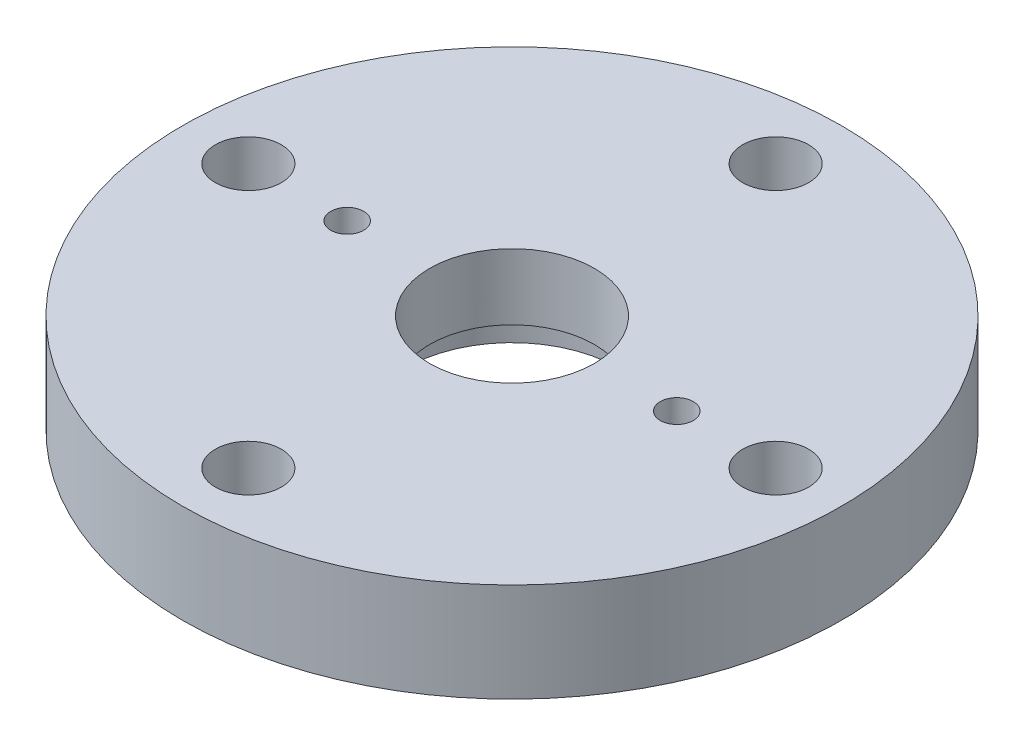
ISO-10303-21;
HEADER;
FILE_DESCRIPTION(('STEP AP214'),'2;1');
FILE_NAME('part.step','',(''),(''),'','','');
FILE_SCHEMA(('AUTOMOTIVE_DESIGN { 1 0 10303 214 1 1 1 1 }'));
ENDSEC;
DATA;
#1=APPLICATION_CONTEXT('core data for automotive mechanical design processes');
#2=APPLICATION_PROTOCOL_DEFINITION('international standard','automotive_design',2000,#1);
#3=PRODUCT_CONTEXT('',#1,'mechanical');
#4=PRODUCT('Part','Part','',(#3));
#5=PRODUCT_RELATED_PRODUCT_CATEGORY('part','',(#4));
#6=PRODUCT_DEFINITION_FORMATION('','',#4);
#7=PRODUCT_DEFINITION_CONTEXT('part definition',#1,'design');
#8=PRODUCT_DEFINITION('design','',#6,#7);
#9=PRODUCT_DEFINITION_SHAPE('','',#8);
#10=(LENGTH_UNIT() NAMED_UNIT(*) SI_UNIT(.MILLI.,.METRE.));
#11=(NAMED_UNIT(*) PLANE_ANGLE_UNIT() SI_UNIT($,.RADIAN.));
#12=(NAMED_UNIT(*) SI_UNIT($,.STERADIAN.) SOLID_ANGLE_UNIT());
#13=UNCERTAINTY_MEASURE_WITH_UNIT(LENGTH_MEASURE(1.E-05),#10,'distance_accuracy_value','');
#14=(GEOMETRIC_REPRESENTATION_CONTEXT(3) GLOBAL_UNCERTAINTY_ASSIGNED_CONTEXT((#13)) GLOBAL_UNIT_ASSIGNED_CONTEXT((#10,
#11,#12)) REPRESENTATION_CONTEXT('',''));
#15=CARTESIAN_POINT('',(0.,0.,0.));
#16=DIRECTION('',(0.,0.,1.));
#17=DIRECTION('',(1.,0.,0.));
#18=AXIS2_PLACEMENT_3D('',#15,#16,#17);
#19=CARTESIAN_POINT('',(0.,0.,0.));
#20=DIRECTION('',(0.,1.,0.));
#21=DIRECTION('',(0.,0.,1.));
#22=AXIS2_PLACEMENT_3D('',#19,#20,#21);
#23=PLANE('',#22);
#24=CARTESIAN_POINT('',(0.,0.,8.));
#25=DIRECTION('',(0.,1.,0.));
#26=DIRECTION('',(0.,0.,1.));
#27=AXIS2_PLACEMENT_3D('',#24,#25,#26);
#28=CIRCLE('',#27,1.);
#29=CARTESIAN_POINT('',(0.,0.,9.));
#30=VERTEX_POINT('',#29);
#31=EDGE_CURVE('E78',#30,#30,#28,.T.);
#32=ORIENTED_EDGE('',*,*,#31,.T.);
#33=EDGE_LOOP('',(#32));
#34=FACE_BOUND('',#33,.T.);
#35=CARTESIAN_POINT('',(-8.,0.,0.));
#36=DIRECTION('',(0.,1.,0.));
#37=DIRECTION('',(0.,0.,-1.));
#38=AXIS2_PLACEMENT_3D('',#35,#36,#37);
#39=CIRCLE('',#38,1.);
#40=CARTESIAN_POINT('',(-8.,0.,-1.));
#41=VERTEX_POINT('',#40);
#42=EDGE_CURVE('E66',#41,#41,#39,.T.);
#43=ORIENTED_EDGE('',*,*,#42,.T.);
#44=EDGE_LOOP('',(#43));
#45=FACE_BOUND('',#44,.T.);
#46=CARTESIAN_POINT('',(5.,0.,0.));
#47=DIRECTION('',(0.,1.,0.));
#48=DIRECTION('',(0.,0.,1.));
#49=AXIS2_PLACEMENT_3D('',#46,#47,#48);
#50=CIRCLE('',#49,0.5);
#51=CARTESIAN_POINT('',(5.,0.,0.5));
#52=VERTEX_POINT('',#51);
#53=EDGE_CURVE('E54',#52,#52,#50,.T.);
#54=ORIENTED_EDGE('',*,*,#53,.T.);
#55=EDGE_LOOP('',(#54));
#56=FACE_BOUND('',#55,.T.);
#57=CARTESIAN_POINT('',(0.,0.,0.));
#58=DIRECTION('',(0.,1.,0.));
#59=DIRECTION('',(0.,0.,1.));
#60=AXIS2_PLACEMENT_3D('',#57,#58,#59);
#61=CIRCLE('',#60,10.);
#62=CARTESIAN_POINT('',(0.,0.,10.));
#63=VERTEX_POINT('',#62);
#64=EDGE_CURVE('E39',#63,#63,#61,.T.);
#65=ORIENTED_EDGE('',*,*,#64,.F.);
#66=EDGE_LOOP('',(#65));
#67=FACE_BOUND('',#66,.T.);
#68=CARTESIAN_POINT('',(8.,0.,0.));
#69=DIRECTION('',(0.,1.,0.));
#70=DIRECTION('',(0.,0.,1.));
#71=AXIS2_PLACEMENT_3D('',#68,#69,#70);
#72=CIRCLE('',#71,1.);
#73=CARTESIAN_POINT('',(8.,0.,1.));
#74=VERTEX_POINT('',#73);
#75=EDGE_CURVE('E48',#74,#74,#72,.T.);
#76=ORIENTED_EDGE('',*,*,#75,.T.);
#77=EDGE_LOOP('',(#76));
#78=FACE_BOUND('',#77,.T.);
#79=CARTESIAN_POINT('',(-5.,0.,0.));
#80=DIRECTION('',(0.,1.,0.));
#81=DIRECTION('',(0.,0.,-1.));
#82=AXIS2_PLACEMENT_3D('',#79,#80,#81);
#83=CIRCLE('',#82,0.5);
#84=CARTESIAN_POINT('',(-5.,0.,-0.5));
#85=VERTEX_POINT('',#84);
#86=EDGE_CURVE('E60',#85,#85,#83,.T.);
#87=ORIENTED_EDGE('',*,*,#86,.T.);
#88=EDGE_LOOP('',(#87));
#89=FACE_BOUND('',#88,.T.);
#90=CARTESIAN_POINT('',(0.,0.,-8.));
#91=DIRECTION('',(0.,1.,0.));
#92=DIRECTION('',(0.,0.,-1.));
#93=AXIS2_PLACEMENT_3D('',#90,#91,#92);
#94=CIRCLE('',#93,1.);
#95=CARTESIAN_POINT('',(0.,0.,-9.));
#96=VERTEX_POINT('',#95);
#97=EDGE_CURVE('E72',#96,#96,#94,.T.);
#98=ORIENTED_EDGE('',*,*,#97,.T.);
#99=EDGE_LOOP('',(#98));
#100=FACE_BOUND('',#99,.T.);
#101=CARTESIAN_POINT('',(0.,0.,0.));
#102=DIRECTION('',(0.,1.,0.));
#103=DIRECTION('',(0.,0.,1.));
#104=AXIS2_PLACEMENT_3D('',#101,#102,#103);
#105=CIRCLE('',#104,3.25);
#106=CARTESIAN_POINT('',(0.,0.,3.25));
#107=VERTEX_POINT('',#106);
#108=EDGE_CURVE('E84',#107,#107,#105,.T.);
#109=ORIENTED_EDGE('',*,*,#108,.T.);
#110=EDGE_LOOP('',(#109));
#111=FACE_BOUND('',#110,.T.);
#112=ADVANCED_FACE('F35',(#34,#45,#56,#67,#78,#89,#100,#111),#23,.F.);
#113=CARTESIAN_POINT('',(0.,3.,0.));
#114=DIRECTION('',(0.,1.,0.));
#115=DIRECTION('',(0.,0.,1.));
#116=AXIS2_PLACEMENT_3D('',#113,#114,#115);
#117=PLANE('',#116);
#118=CARTESIAN_POINT('',(0.,3.,0.));
#119=DIRECTION('',(0.,1.,0.));
#120=DIRECTION('',(0.,0.,1.));
#121=AXIS2_PLACEMENT_3D('',#118,#119,#120);
#122=CIRCLE('',#121,2.5);
#123=CARTESIAN_POINT('',(0.,3.,2.5));
#124=VERTEX_POINT('',#123);
#125=EDGE_CURVE('E90',#124,#124,#122,.F.);
#126=ORIENTED_EDGE('',*,*,#125,.T.);
#127=EDGE_LOOP('',(#126));
#128=FACE_BOUND('',#127,.T.);
#129=CARTESIAN_POINT('',(0.,3.,-8.));
#130=DIRECTION('',(0.,1.,0.));
#131=DIRECTION('',(0.,0.,-1.));
#132=AXIS2_PLACEMENT_3D('',#129,#130,#131);
#133=CIRCLE('',#132,1.);
#134=CARTESIAN_POINT('',(0.,3.,-9.));
#135=VERTEX_POINT('',#134);
#136=EDGE_CURVE('E69',#135,#135,#133,.T.);
#137=ORIENTED_EDGE('',*,*,#136,.F.);
#138=EDGE_LOOP('',(#137));
#139=FACE_BOUND('',#138,.T.);
#140=CARTESIAN_POINT('',(-5.,3.,0.));
#141=DIRECTION('',(0.,1.,0.));
#142=DIRECTION('',(0.,0.,-1.));
#143=AXIS2_PLACEMENT_3D('',#140,#141,#142);
#144=CIRCLE('',#143,0.5);
#145=CARTESIAN_POINT('',(-5.,3.,-0.5));
#146=VERTEX_POINT('',#145);
#147=EDGE_CURVE('E57',#146,#146,#144,.T.);
#148=ORIENTED_EDGE('',*,*,#147,.F.);
#149=EDGE_LOOP('',(#148));
#150=FACE_BOUND('',#149,.T.);
#151=CARTESIAN_POINT('',(8.,3.,0.));
#152=DIRECTION('',(0.,1.,0.));
#153=DIRECTION('',(0.,0.,1.));
#154=AXIS2_PLACEMENT_3D('',#151,#152,#153);
#155=CIRCLE('',#154,1.);
#156=CARTESIAN_POINT('',(8.,3.,1.));
#157=VERTEX_POINT('',#156);
#158=EDGE_CURVE('E46',#157,#157,#155,.T.);
#159=ORIENTED_EDGE('',*,*,#158,.F.);
#160=EDGE_LOOP('',(#159));
#161=FACE_BOUND('',#160,.T.);
#162=CARTESIAN_POINT('',(0.,3.,0.));
#163=DIRECTION('',(0.,1.,0.));
#164=DIRECTION('',(0.,0.,1.));
#165=AXIS2_PLACEMENT_3D('',#162,#163,#164);
#166=CIRCLE('',#165,10.);
#167=CARTESIAN_POINT('',(0.,3.,10.));
#168=VERTEX_POINT('',#167);
#169=EDGE_CURVE('E10',#168,#168,#166,.T.);
#170=ORIENTED_EDGE('',*,*,#169,.T.);
#171=EDGE_LOOP('',(#170));
#172=FACE_BOUND('',#171,.T.);
#173=CARTESIAN_POINT('',(5.,3.,0.));
#174=DIRECTION('',(0.,1.,0.));
#175=DIRECTION('',(0.,0.,1.));
#176=AXIS2_PLACEMENT_3D('',#173,#174,#175);
#177=CIRCLE('',#176,0.5);
#178=CARTESIAN_POINT('',(5.,3.,0.5));
#179=VERTEX_POINT('',#178);
#180=EDGE_CURVE('E51',#179,#179,#177,.T.);
#181=ORIENTED_EDGE('',*,*,#180,.F.);
#182=EDGE_LOOP('',(#181));
#183=FACE_BOUND('',#182,.T.);
#184=CARTESIAN_POINT('',(-8.,3.,0.));
#185=DIRECTION('',(0.,1.,0.));
#186=DIRECTION('',(0.,0.,-1.));
#187=AXIS2_PLACEMENT_3D('',#184,#185,#186);
#188=CIRCLE('',#187,1.);
#189=CARTESIAN_POINT('',(-8.,3.,-1.));
#190=VERTEX_POINT('',#189);
#191=EDGE_CURVE('E63',#190,#190,#188,.T.);
#192=ORIENTED_EDGE('',*,*,#191,.F.);
#193=EDGE_LOOP('',(#192));
#194=FACE_BOUND('',#193,.T.);
#195=CARTESIAN_POINT('',(0.,3.,8.));
#196=DIRECTION('',(0.,1.,0.));
#197=DIRECTION('',(0.,0.,1.));
#198=AXIS2_PLACEMENT_3D('',#195,#196,#197);
#199=CIRCLE('',#198,1.);
#200=CARTESIAN_POINT('',(0.,3.,9.));
#201=VERTEX_POINT('',#200);
#202=EDGE_CURVE('E75',#201,#201,#199,.T.);
#203=ORIENTED_EDGE('',*,*,#202,.F.);
#204=EDGE_LOOP('',(#203));
#205=FACE_BOUND('',#204,.T.);
#206=ADVANCED_FACE('F112',(#128,#139,#150,#161,#172,#183,#194,#205),#117,.T.);
#207=CARTESIAN_POINT('',(0.,3.,0.));
#208=DIRECTION('',(0.,-1.,0.));
#209=DIRECTION('',(0.,0.,-1.));
#210=AXIS2_PLACEMENT_3D('',#207,#208,#209);
#211=CYLINDRICAL_SURFACE('',#210,10.);
#212=ORIENTED_EDGE('',*,*,#169,.F.);
#213=EDGE_LOOP('',(#212));
#214=FACE_BOUND('',#213,.T.);
#215=ORIENTED_EDGE('',*,*,#64,.T.);
#216=EDGE_LOOP('',(#215));
#217=FACE_BOUND('',#216,.T.);
#218=ADVANCED_FACE('F37',(#214,#217),#211,.T.);
#219=CARTESIAN_POINT('',(8.,3.,0.));
#220=DIRECTION('',(0.,-1.,0.));
#221=DIRECTION('',(0.,0.,-1.));
#222=AXIS2_PLACEMENT_3D('',#219,#220,#221);
#223=CYLINDRICAL_SURFACE('',#222,1.);
#224=ORIENTED_EDGE('',*,*,#158,.T.);
#225=EDGE_LOOP('',(#224));
#226=FACE_BOUND('',#225,.T.);
#227=ORIENTED_EDGE('',*,*,#75,.F.);
#228=EDGE_LOOP('',(#227));
#229=FACE_BOUND('',#228,.T.);
#230=ADVANCED_FACE('F121',(#226,#229),#223,.F.);
#231=CARTESIAN_POINT('',(5.,3.,0.));
#232=DIRECTION('',(0.,-1.,0.));
#233=DIRECTION('',(0.,0.,-1.));
#234=AXIS2_PLACEMENT_3D('',#231,#232,#233);
#235=CYLINDRICAL_SURFACE('',#234,0.5);
#236=ORIENTED_EDGE('',*,*,#180,.T.);
#237=EDGE_LOOP('',(#236));
#238=FACE_BOUND('',#237,.T.);
#239=ORIENTED_EDGE('',*,*,#53,.F.);
#240=EDGE_LOOP('',(#239));
#241=FACE_BOUND('',#240,.T.);
#242=ADVANCED_FACE('F124',(#238,#241),#235,.F.);
#243=CARTESIAN_POINT('',(-5.,3.,0.));
#244=DIRECTION('',(0.,-1.,0.));
#245=DIRECTION('',(0.,0.,-1.));
#246=AXIS2_PLACEMENT_3D('',#243,#244,#245);
#247=CYLINDRICAL_SURFACE('',#246,0.5);
#248=ORIENTED_EDGE('',*,*,#147,.T.);
#249=EDGE_LOOP('',(#248));
#250=FACE_BOUND('',#249,.T.);
#251=ORIENTED_EDGE('',*,*,#86,.F.);
#252=EDGE_LOOP('',(#251));
#253=FACE_BOUND('',#252,.T.);
#254=ADVANCED_FACE('F128',(#250,#253),#247,.F.);
#255=CARTESIAN_POINT('',(-8.,3.,0.));
#256=DIRECTION('',(0.,-1.,0.));
#257=DIRECTION('',(0.,0.,-1.));
#258=AXIS2_PLACEMENT_3D('',#255,#256,#257);
#259=CYLINDRICAL_SURFACE('',#258,1.);
#260=ORIENTED_EDGE('',*,*,#191,.T.);
#261=EDGE_LOOP('',(#260));
#262=FACE_BOUND('',#261,.T.);
#263=ORIENTED_EDGE('',*,*,#42,.F.);
#264=EDGE_LOOP('',(#263));
#265=FACE_BOUND('',#264,.T.);
#266=ADVANCED_FACE('F132',(#262,#265),#259,.F.);
#267=CARTESIAN_POINT('',(0.,3.,-8.));
#268=DIRECTION('',(0.,-1.,0.));
#269=DIRECTION('',(0.,0.,-1.));
#270=AXIS2_PLACEMENT_3D('',#267,#268,#269);
#271=CYLINDRICAL_SURFACE('',#270,1.);
#272=ORIENTED_EDGE('',*,*,#136,.T.);
#273=EDGE_LOOP('',(#272));
#274=FACE_BOUND('',#273,.T.);
#275=ORIENTED_EDGE('',*,*,#97,.F.);
#276=EDGE_LOOP('',(#275));
#277=FACE_BOUND('',#276,.T.);
#278=ADVANCED_FACE('F136',(#274,#277),#271,.F.);
#279=CARTESIAN_POINT('',(0.,3.,8.));
#280=DIRECTION('',(0.,-1.,0.));
#281=DIRECTION('',(0.,0.,-1.));
#282=AXIS2_PLACEMENT_3D('',#279,#280,#281);
#283=CYLINDRICAL_SURFACE('',#282,1.);
#284=ORIENTED_EDGE('',*,*,#202,.T.);
#285=EDGE_LOOP('',(#284));
#286=FACE_BOUND('',#285,.T.);
#287=ORIENTED_EDGE('',*,*,#31,.F.);
#288=EDGE_LOOP('',(#287));
#289=FACE_BOUND('',#288,.T.);
#290=ADVANCED_FACE('F107',(#286,#289),#283,.F.);
#291=CARTESIAN_POINT('',(0.,1.,0.));
#292=DIRECTION('',(0.,-1.,0.));
#293=DIRECTION('',(0.,0.,-1.));
#294=AXIS2_PLACEMENT_3D('',#291,#292,#293);
#295=CYLINDRICAL_SURFACE('',#294,3.25);
#296=CARTESIAN_POINT('',(0.,1.,0.));
#297=DIRECTION('',(0.,1.,0.));
#298=DIRECTION('',(0.,0.,1.));
#299=AXIS2_PLACEMENT_3D('',#296,#297,#298);
#300=CIRCLE('',#299,3.25);
#301=CARTESIAN_POINT('',(0.,1.,3.25));
#302=VERTEX_POINT('',#301);
#303=EDGE_CURVE('E81',#302,#302,#300,.T.);
#304=ORIENTED_EDGE('',*,*,#303,.T.);
#305=EDGE_LOOP('',(#304));
#306=FACE_BOUND('',#305,.T.);
#307=ORIENTED_EDGE('',*,*,#108,.F.);
#308=EDGE_LOOP('',(#307));
#309=FACE_BOUND('',#308,.T.);
#310=ADVANCED_FACE('F101',(#306,#309),#295,.F.);
#311=CARTESIAN_POINT('',(0.,1.,0.));
#312=DIRECTION('',(0.,1.,0.));
#313=DIRECTION('',(0.,0.,1.));
#314=AXIS2_PLACEMENT_3D('',#311,#312,#313);
#315=PLANE('',#314);
#316=CARTESIAN_POINT('',(0.,1.,0.));
#317=DIRECTION('',(0.,-1.,0.));
#318=DIRECTION('',(0.,0.,-1.));
#319=AXIS2_PLACEMENT_3D('',#316,#317,#318);
#320=CIRCLE('',#319,2.5);
#321=CARTESIAN_POINT('',(0.,1.,-2.5));
#322=VERTEX_POINT('',#321);
#323=EDGE_CURVE('E87',#322,#322,#320,.T.);
#324=ORIENTED_EDGE('',*,*,#323,.F.);
#325=EDGE_LOOP('',(#324));
#326=FACE_BOUND('',#325,.T.);
#327=ORIENTED_EDGE('',*,*,#303,.F.);
#328=EDGE_LOOP('',(#327));
#329=FACE_BOUND('',#328,.T.);
#330=ADVANCED_FACE('F98',(#326,#329),#315,.F.);
#331=CARTESIAN_POINT('',(0.,3.001,0.));
#332=DIRECTION('',(0.,-1.,0.));
#333=DIRECTION('',(0.,0.,-1.));
#334=AXIS2_PLACEMENT_3D('',#331,#332,#333);
#335=CYLINDRICAL_SURFACE('',#334,2.5);
#336=ORIENTED_EDGE('',*,*,#125,.F.);
#337=EDGE_LOOP('',(#336));
#338=FACE_BOUND('',#337,.T.);
#339=ORIENTED_EDGE('',*,*,#323,.T.);
#340=EDGE_LOOP('',(#339));
#341=FACE_BOUND('',#340,.T.);
#342=ADVANCED_FACE('F96',(#338,#341),#335,.F.);
#343=CLOSED_SHELL('',(#112,#206,#218,#230,#242,#254,#266,#278,#290,#310,#330,#342));
#344=MANIFOLD_SOLID_BREP('B2',#343);
#345=ADVANCED_BREP_SHAPE_REPRESENTATION('',(#18,#344),#14);
#346=SHAPE_DEFINITION_REPRESENTATION(#9,#345);
ENDSEC;
END-ISO-10303-21;
